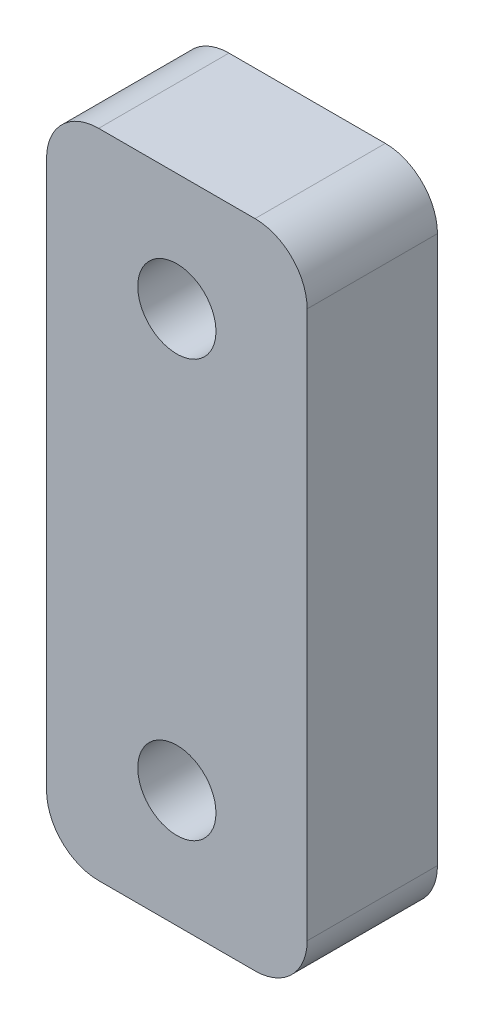
ISO-10303-21;
HEADER;
FILE_DESCRIPTION(('STEP AP214'),'2;1');
FILE_NAME('part.step','',(''),(''),'','','');
FILE_SCHEMA(('AUTOMOTIVE_DESIGN { 1 0 10303 214 1 1 1 1 }'));
ENDSEC;
DATA;
#1=APPLICATION_CONTEXT('core data for automotive mechanical design processes');
#2=APPLICATION_PROTOCOL_DEFINITION('international standard','automotive_design',2000,#1);
#3=PRODUCT_CONTEXT('',#1,'mechanical');
#4=PRODUCT('Part','Part','',(#3));
#5=PRODUCT_RELATED_PRODUCT_CATEGORY('part','',(#4));
#6=PRODUCT_DEFINITION_FORMATION('','',#4);
#7=PRODUCT_DEFINITION_CONTEXT('part definition',#1,'design');
#8=PRODUCT_DEFINITION('design','',#6,#7);
#9=PRODUCT_DEFINITION_SHAPE('','',#8);
#10=(LENGTH_UNIT() NAMED_UNIT(*) SI_UNIT(.MILLI.,.METRE.));
#11=(NAMED_UNIT(*) PLANE_ANGLE_UNIT() SI_UNIT($,.RADIAN.));
#12=(NAMED_UNIT(*) SI_UNIT($,.STERADIAN.) SOLID_ANGLE_UNIT());
#13=UNCERTAINTY_MEASURE_WITH_UNIT(LENGTH_MEASURE(1.E-05),#10,'distance_accuracy_value','');
#14=(GEOMETRIC_REPRESENTATION_CONTEXT(3) GLOBAL_UNCERTAINTY_ASSIGNED_CONTEXT((#13)) GLOBAL_UNIT_ASSIGNED_CONTEXT((#10,
#11,#12)) REPRESENTATION_CONTEXT('',''));
#15=CARTESIAN_POINT('',(0.,0.,0.));
#16=DIRECTION('',(0.,0.,1.));
#17=DIRECTION('',(1.,0.,0.));
#18=AXIS2_PLACEMENT_3D('',#15,#16,#17);
#19=CARTESIAN_POINT('',(-5.,-12.5,5.));
#20=DIRECTION('',(1.,0.,0.));
#21=DIRECTION('',(0.,0.,-1.));
#22=AXIS2_PLACEMENT_3D('',#19,#20,#21);
#23=PLANE('',#22);
#24=DIRECTION('',(0.,-1.,0.));
#25=VECTOR('',#24,1.);
#26=CARTESIAN_POINT('',(-5.,-12.5,0.));
#27=LINE('',#26,#25);
#28=CARTESIAN_POINT('',(-5.,10.5,0.));
#29=VERTEX_POINT('',#28);
#30=CARTESIAN_POINT('',(-5.,-10.5,0.));
#31=VERTEX_POINT('',#30);
#32=EDGE_CURVE('E138',#29,#31,#27,.T.);
#33=ORIENTED_EDGE('',*,*,#32,.T.);
#34=DIRECTION('',(0.,0.,-1.));
#35=VECTOR('',#34,1.);
#36=CARTESIAN_POINT('',(-5.,-10.5,5.));
#37=LINE('',#36,#35);
#38=CARTESIAN_POINT('',(-5.,-10.5,5.));
#39=VERTEX_POINT('',#38);
#40=EDGE_CURVE('E160',#31,#39,#37,.F.);
#41=ORIENTED_EDGE('',*,*,#40,.T.);
#42=DIRECTION('',(0.,-1.,0.));
#43=VECTOR('',#42,1.);
#44=CARTESIAN_POINT('',(-5.,-12.5,5.));
#45=LINE('',#44,#43);
#46=CARTESIAN_POINT('',(-5.,10.5,5.));
#47=VERTEX_POINT('',#46);
#48=EDGE_CURVE('E136',#47,#39,#45,.T.);
#49=ORIENTED_EDGE('',*,*,#48,.F.);
#50=DIRECTION('',(0.,0.,-1.));
#51=VECTOR('',#50,1.);
#52=CARTESIAN_POINT('',(-5.,10.5,5.));
#53=LINE('',#52,#51);
#54=EDGE_CURVE('E157',#47,#29,#53,.T.);
#55=ORIENTED_EDGE('',*,*,#54,.T.);
#56=EDGE_LOOP('',(#33,#41,#49,#55));
#57=FACE_BOUND('',#56,.T.);
#58=ADVANCED_FACE('F41',(#57),#23,.F.);
#59=CARTESIAN_POINT('',(5.,-12.5,5.));
#60=DIRECTION('',(0.,1.,0.));
#61=DIRECTION('',(-1.,0.,0.));
#62=AXIS2_PLACEMENT_3D('',#59,#60,#61);
#63=PLANE('',#62);
#64=DIRECTION('',(1.,0.,0.));
#65=VECTOR('',#64,1.);
#66=CARTESIAN_POINT('',(5.,-12.5,0.));
#67=LINE('',#66,#65);
#68=CARTESIAN_POINT('',(-3.,-12.5,0.));
#69=VERTEX_POINT('',#68);
#70=CARTESIAN_POINT('',(3.,-12.5,0.));
#71=VERTEX_POINT('',#70);
#72=EDGE_CURVE('E134',#69,#71,#67,.T.);
#73=ORIENTED_EDGE('',*,*,#72,.T.);
#74=DIRECTION('',(0.,0.,-1.));
#75=VECTOR('',#74,1.);
#76=CARTESIAN_POINT('',(3.,-12.5,5.));
#77=LINE('',#76,#75);
#78=CARTESIAN_POINT('',(3.,-12.5,5.));
#79=VERTEX_POINT('',#78);
#80=EDGE_CURVE('E112',#71,#79,#77,.F.);
#81=ORIENTED_EDGE('',*,*,#80,.T.);
#82=DIRECTION('',(1.,0.,0.));
#83=VECTOR('',#82,1.);
#84=CARTESIAN_POINT('',(5.,-12.5,5.));
#85=LINE('',#84,#83);
#86=CARTESIAN_POINT('',(-3.,-12.5,5.));
#87=VERTEX_POINT('',#86);
#88=EDGE_CURVE('E174',#87,#79,#85,.T.);
#89=ORIENTED_EDGE('',*,*,#88,.F.);
#90=DIRECTION('',(0.,0.,-1.));
#91=VECTOR('',#90,1.);
#92=CARTESIAN_POINT('',(-3.,-12.5,5.));
#93=LINE('',#92,#91);
#94=EDGE_CURVE('E117',#87,#69,#93,.T.);
#95=ORIENTED_EDGE('',*,*,#94,.T.);
#96=EDGE_LOOP('',(#73,#81,#89,#95));
#97=FACE_BOUND('',#96,.T.);
#98=ADVANCED_FACE('F179',(#97),#63,.F.);
#99=CARTESIAN_POINT('',(5.,-12.5,5.));
#100=DIRECTION('',(-1.,0.,0.));
#101=DIRECTION('',(0.,0.,1.));
#102=AXIS2_PLACEMENT_3D('',#99,#100,#101);
#103=PLANE('',#102);
#104=DIRECTION('',(0.,1.,0.));
#105=VECTOR('',#104,1.);
#106=CARTESIAN_POINT('',(5.,-12.5,5.));
#107=LINE('',#106,#105);
#108=CARTESIAN_POINT('',(5.,-10.5,5.));
#109=VERTEX_POINT('',#108);
#110=CARTESIAN_POINT('',(5.,10.5,5.));
#111=VERTEX_POINT('',#110);
#112=EDGE_CURVE('E126',#109,#111,#107,.T.);
#113=ORIENTED_EDGE('',*,*,#112,.F.);
#114=DIRECTION('',(0.,0.,-1.));
#115=VECTOR('',#114,1.);
#116=CARTESIAN_POINT('',(5.,-10.5,5.));
#117=LINE('',#116,#115);
#118=CARTESIAN_POINT('',(5.,-10.5,0.));
#119=VERTEX_POINT('',#118);
#120=EDGE_CURVE('E111',#109,#119,#117,.T.);
#121=ORIENTED_EDGE('',*,*,#120,.T.);
#122=DIRECTION('',(0.,1.,0.));
#123=VECTOR('',#122,1.);
#124=CARTESIAN_POINT('',(5.,-12.5,0.));
#125=LINE('',#124,#123);
#126=CARTESIAN_POINT('',(5.,10.5,0.));
#127=VERTEX_POINT('',#126);
#128=EDGE_CURVE('E124',#119,#127,#125,.T.);
#129=ORIENTED_EDGE('',*,*,#128,.T.);
#130=DIRECTION('',(0.,0.,-1.));
#131=VECTOR('',#130,1.);
#132=CARTESIAN_POINT('',(5.,10.5,5.));
#133=LINE('',#132,#131);
#134=EDGE_CURVE('E128',#127,#111,#133,.F.);
#135=ORIENTED_EDGE('',*,*,#134,.T.);
#136=EDGE_LOOP('',(#113,#121,#129,#135));
#137=FACE_BOUND('',#136,.T.);
#138=ADVANCED_FACE('F123',(#137),#103,.F.);
#139=CARTESIAN_POINT('',(5.,12.5,5.));
#140=DIRECTION('',(0.,-1.,0.));
#141=DIRECTION('',(1.,0.,0.));
#142=AXIS2_PLACEMENT_3D('',#139,#140,#141);
#143=PLANE('',#142);
#144=DIRECTION('',(-1.,0.,0.));
#145=VECTOR('',#144,1.);
#146=CARTESIAN_POINT('',(5.,12.5,5.));
#147=LINE('',#146,#145);
#148=CARTESIAN_POINT('',(3.,12.5,5.));
#149=VERTEX_POINT('',#148);
#150=CARTESIAN_POINT('',(-3.,12.5,5.));
#151=VERTEX_POINT('',#150);
#152=EDGE_CURVE('E142',#149,#151,#147,.T.);
#153=ORIENTED_EDGE('',*,*,#152,.F.);
#154=DIRECTION('',(0.,0.,-1.));
#155=VECTOR('',#154,1.);
#156=CARTESIAN_POINT('',(3.,12.5,5.));
#157=LINE('',#156,#155);
#158=CARTESIAN_POINT('',(3.,12.5,0.));
#159=VERTEX_POINT('',#158);
#160=EDGE_CURVE('E11',#149,#159,#157,.T.);
#161=ORIENTED_EDGE('',*,*,#160,.T.);
#162=DIRECTION('',(-1.,0.,0.));
#163=VECTOR('',#162,1.);
#164=CARTESIAN_POINT('',(5.,12.5,0.));
#165=LINE('',#164,#163);
#166=CARTESIAN_POINT('',(-3.,12.5,0.));
#167=VERTEX_POINT('',#166);
#168=EDGE_CURVE('E133',#159,#167,#165,.T.);
#169=ORIENTED_EDGE('',*,*,#168,.T.);
#170=DIRECTION('',(0.,0.,-1.));
#171=VECTOR('',#170,1.);
#172=CARTESIAN_POINT('',(-3.,12.5,5.));
#173=LINE('',#172,#171);
#174=EDGE_CURVE('E49',#167,#151,#173,.F.);
#175=ORIENTED_EDGE('',*,*,#174,.T.);
#176=EDGE_LOOP('',(#153,#161,#169,#175));
#177=FACE_BOUND('',#176,.T.);
#178=ADVANCED_FACE('F201',(#177),#143,.F.);
#179=CARTESIAN_POINT('',(0.,0.,5.));
#180=DIRECTION('',(0.,0.,1.));
#181=DIRECTION('',(1.,0.,0.));
#182=AXIS2_PLACEMENT_3D('',#179,#180,#181);
#183=PLANE('',#182);
#184=CARTESIAN_POINT('',(0.,-8.,5.));
#185=DIRECTION('',(0.,0.,1.));
#186=DIRECTION('',(1.,0.,0.));
#187=AXIS2_PLACEMENT_3D('',#184,#185,#186);
#188=CIRCLE('',#187,1.5);
#189=CARTESIAN_POINT('',(1.5,-8.,5.));
#190=VERTEX_POINT('',#189);
#191=EDGE_CURVE('E182',#190,#190,#188,.T.);
#192=ORIENTED_EDGE('',*,*,#191,.F.);
#193=EDGE_LOOP('',(#192));
#194=FACE_BOUND('',#193,.T.);
#195=CARTESIAN_POINT('',(0.,8.,5.));
#196=DIRECTION('',(0.,0.,1.));
#197=DIRECTION('',(-1.,0.,0.));
#198=AXIS2_PLACEMENT_3D('',#195,#196,#197);
#199=CIRCLE('',#198,1.5);
#200=CARTESIAN_POINT('',(-1.5,8.,5.));
#201=VERTEX_POINT('',#200);
#202=EDGE_CURVE('E191',#201,#201,#199,.T.);
#203=ORIENTED_EDGE('',*,*,#202,.F.);
#204=EDGE_LOOP('',(#203));
#205=FACE_BOUND('',#204,.T.);
#206=ORIENTED_EDGE('',*,*,#88,.T.);
#207=CARTESIAN_POINT('',(3.,-10.5,5.));
#208=DIRECTION('',(0.,0.,1.));
#209=DIRECTION('',(1.,0.,0.));
#210=AXIS2_PLACEMENT_3D('',#207,#208,#209);
#211=CIRCLE('',#210,2.);
#212=EDGE_CURVE('E155',#79,#109,#211,.T.);
#213=ORIENTED_EDGE('',*,*,#212,.T.);
#214=ORIENTED_EDGE('',*,*,#112,.T.);
#215=CARTESIAN_POINT('',(3.,10.5,5.));
#216=DIRECTION('',(0.,0.,1.));
#217=DIRECTION('',(1.,0.,0.));
#218=AXIS2_PLACEMENT_3D('',#215,#216,#217);
#219=CIRCLE('',#218,2.);
#220=EDGE_CURVE('E62',#111,#149,#219,.T.);
#221=ORIENTED_EDGE('',*,*,#220,.T.);
#222=ORIENTED_EDGE('',*,*,#152,.T.);
#223=CARTESIAN_POINT('',(-3.,10.5,5.));
#224=DIRECTION('',(0.,0.,1.));
#225=DIRECTION('',(1.,0.,0.));
#226=AXIS2_PLACEMENT_3D('',#223,#224,#225);
#227=CIRCLE('',#226,2.);
#228=EDGE_CURVE('E150',#151,#47,#227,.T.);
#229=ORIENTED_EDGE('',*,*,#228,.T.);
#230=ORIENTED_EDGE('',*,*,#48,.T.);
#231=CARTESIAN_POINT('',(-3.,-10.5,5.));
#232=DIRECTION('',(0.,0.,1.));
#233=DIRECTION('',(1.,0.,0.));
#234=AXIS2_PLACEMENT_3D('',#231,#232,#233);
#235=CIRCLE('',#234,2.);
#236=EDGE_CURVE('E153',#39,#87,#235,.T.);
#237=ORIENTED_EDGE('',*,*,#236,.T.);
#238=EDGE_LOOP('',(#206,#213,#214,#221,#222,#229,#230,#237));
#239=FACE_BOUND('',#238,.T.);
#240=ADVANCED_FACE('F171',(#194,#205,#239),#183,.T.);
#241=CARTESIAN_POINT('',(0.,0.,0.));
#242=DIRECTION('',(0.,0.,1.));
#243=DIRECTION('',(1.,0.,0.));
#244=AXIS2_PLACEMENT_3D('',#241,#242,#243);
#245=PLANE('',#244);
#246=CARTESIAN_POINT('',(0.,-8.,0.));
#247=DIRECTION('',(0.,0.,1.));
#248=DIRECTION('',(1.,0.,0.));
#249=AXIS2_PLACEMENT_3D('',#246,#247,#248);
#250=CIRCLE('',#249,1.5);
#251=CARTESIAN_POINT('',(1.5,-8.,0.));
#252=VERTEX_POINT('',#251);
#253=EDGE_CURVE('E180',#252,#252,#250,.T.);
#254=ORIENTED_EDGE('',*,*,#253,.T.);
#255=EDGE_LOOP('',(#254));
#256=FACE_BOUND('',#255,.T.);
#257=CARTESIAN_POINT('',(0.,8.,0.));
#258=DIRECTION('',(0.,0.,1.));
#259=DIRECTION('',(-1.,0.,0.));
#260=AXIS2_PLACEMENT_3D('',#257,#258,#259);
#261=CIRCLE('',#260,1.5);
#262=CARTESIAN_POINT('',(-1.5,8.,0.));
#263=VERTEX_POINT('',#262);
#264=EDGE_CURVE('E188',#263,#263,#261,.T.);
#265=ORIENTED_EDGE('',*,*,#264,.T.);
#266=EDGE_LOOP('',(#265));
#267=FACE_BOUND('',#266,.T.);
#268=ORIENTED_EDGE('',*,*,#128,.F.);
#269=CARTESIAN_POINT('',(3.,-10.5,0.));
#270=DIRECTION('',(0.,0.,1.));
#271=DIRECTION('',(1.,0.,0.));
#272=AXIS2_PLACEMENT_3D('',#269,#270,#271);
#273=CIRCLE('',#272,2.);
#274=EDGE_CURVE('E107',#119,#71,#273,.F.);
#275=ORIENTED_EDGE('',*,*,#274,.T.);
#276=ORIENTED_EDGE('',*,*,#72,.F.);
#277=CARTESIAN_POINT('',(-3.,-10.5,0.));
#278=DIRECTION('',(0.,0.,1.));
#279=DIRECTION('',(1.,0.,0.));
#280=AXIS2_PLACEMENT_3D('',#277,#278,#279);
#281=CIRCLE('',#280,2.);
#282=EDGE_CURVE('E118',#69,#31,#281,.F.);
#283=ORIENTED_EDGE('',*,*,#282,.T.);
#284=ORIENTED_EDGE('',*,*,#32,.F.);
#285=CARTESIAN_POINT('',(-3.,10.5,0.));
#286=DIRECTION('',(0.,0.,1.));
#287=DIRECTION('',(1.,0.,0.));
#288=AXIS2_PLACEMENT_3D('',#285,#286,#287);
#289=CIRCLE('',#288,2.);
#290=EDGE_CURVE('E127',#29,#167,#289,.F.);
#291=ORIENTED_EDGE('',*,*,#290,.T.);
#292=ORIENTED_EDGE('',*,*,#168,.F.);
#293=CARTESIAN_POINT('',(3.,10.5,0.));
#294=DIRECTION('',(0.,0.,1.));
#295=DIRECTION('',(1.,0.,0.));
#296=AXIS2_PLACEMENT_3D('',#293,#294,#295);
#297=CIRCLE('',#296,2.);
#298=EDGE_CURVE('E132',#159,#127,#297,.F.);
#299=ORIENTED_EDGE('',*,*,#298,.T.);
#300=EDGE_LOOP('',(#268,#275,#276,#283,#284,#291,#292,#299));
#301=FACE_BOUND('',#300,.T.);
#302=ADVANCED_FACE('F130',(#256,#267,#301),#245,.F.);
#303=CARTESIAN_POINT('',(0.,8.,0.));
#304=DIRECTION('',(0.,0.,1.));
#305=DIRECTION('',(1.,0.,0.));
#306=AXIS2_PLACEMENT_3D('',#303,#304,#305);
#307=CYLINDRICAL_SURFACE('',#306,1.5);
#308=ORIENTED_EDGE('',*,*,#264,.F.);
#309=EDGE_LOOP('',(#308));
#310=FACE_BOUND('',#309,.T.);
#311=ORIENTED_EDGE('',*,*,#202,.T.);
#312=EDGE_LOOP('',(#311));
#313=FACE_BOUND('',#312,.T.);
#314=ADVANCED_FACE('F205',(#310,#313),#307,.F.);
#315=CARTESIAN_POINT('',(0.,-8.,0.));
#316=DIRECTION('',(0.,0.,1.));
#317=DIRECTION('',(1.,0.,0.));
#318=AXIS2_PLACEMENT_3D('',#315,#316,#317);
#319=CYLINDRICAL_SURFACE('',#318,1.5);
#320=ORIENTED_EDGE('',*,*,#253,.F.);
#321=EDGE_LOOP('',(#320));
#322=FACE_BOUND('',#321,.T.);
#323=ORIENTED_EDGE('',*,*,#191,.T.);
#324=EDGE_LOOP('',(#323));
#325=FACE_BOUND('',#324,.T.);
#326=ADVANCED_FACE('F197',(#322,#325),#319,.F.);
#327=CARTESIAN_POINT('',(3.,-10.5,5.));
#328=DIRECTION('',(0.,0.,-1.));
#329=DIRECTION('',(-1.,0.,0.));
#330=AXIS2_PLACEMENT_3D('',#327,#328,#329);
#331=CYLINDRICAL_SURFACE('',#330,2.);
#332=ORIENTED_EDGE('',*,*,#212,.F.);
#333=ORIENTED_EDGE('',*,*,#80,.F.);
#334=ORIENTED_EDGE('',*,*,#274,.F.);
#335=ORIENTED_EDGE('',*,*,#120,.F.);
#336=EDGE_LOOP('',(#332,#333,#334,#335));
#337=FACE_BOUND('',#336,.T.);
#338=ADVANCED_FACE('F110',(#337),#331,.T.);
#339=CARTESIAN_POINT('',(-3.,-10.5,5.));
#340=DIRECTION('',(0.,0.,-1.));
#341=DIRECTION('',(-1.,0.,0.));
#342=AXIS2_PLACEMENT_3D('',#339,#340,#341);
#343=CYLINDRICAL_SURFACE('',#342,2.);
#344=ORIENTED_EDGE('',*,*,#236,.F.);
#345=ORIENTED_EDGE('',*,*,#40,.F.);
#346=ORIENTED_EDGE('',*,*,#282,.F.);
#347=ORIENTED_EDGE('',*,*,#94,.F.);
#348=EDGE_LOOP('',(#344,#345,#346,#347));
#349=FACE_BOUND('',#348,.T.);
#350=ADVANCED_FACE('F177',(#349),#343,.T.);
#351=CARTESIAN_POINT('',(3.,10.5,5.));
#352=DIRECTION('',(0.,0.,-1.));
#353=DIRECTION('',(-1.,0.,0.));
#354=AXIS2_PLACEMENT_3D('',#351,#352,#353);
#355=CYLINDRICAL_SURFACE('',#354,2.);
#356=ORIENTED_EDGE('',*,*,#220,.F.);
#357=ORIENTED_EDGE('',*,*,#134,.F.);
#358=ORIENTED_EDGE('',*,*,#298,.F.);
#359=ORIENTED_EDGE('',*,*,#160,.F.);
#360=EDGE_LOOP('',(#356,#357,#358,#359));
#361=FACE_BOUND('',#360,.T.);
#362=ADVANCED_FACE('F229',(#361),#355,.T.);
#363=CARTESIAN_POINT('',(-3.,10.5,5.));
#364=DIRECTION('',(0.,0.,-1.));
#365=DIRECTION('',(-1.,0.,0.));
#366=AXIS2_PLACEMENT_3D('',#363,#364,#365);
#367=CYLINDRICAL_SURFACE('',#366,2.);
#368=ORIENTED_EDGE('',*,*,#228,.F.);
#369=ORIENTED_EDGE('',*,*,#174,.F.);
#370=ORIENTED_EDGE('',*,*,#290,.F.);
#371=ORIENTED_EDGE('',*,*,#54,.F.);
#372=EDGE_LOOP('',(#368,#369,#370,#371));
#373=FACE_BOUND('',#372,.T.);
#374=ADVANCED_FACE('F43',(#373),#367,.T.);
#375=CLOSED_SHELL('',(#58,#98,#138,#178,#240,#302,#314,#326,#338,#350,#362,#374));
#376=MANIFOLD_SOLID_BREP('B2',#375);
#377=ADVANCED_BREP_SHAPE_REPRESENTATION('',(#18,#376),#14);
#378=SHAPE_DEFINITION_REPRESENTATION(#9,#377);
ENDSEC;
END-ISO-10303-21;
